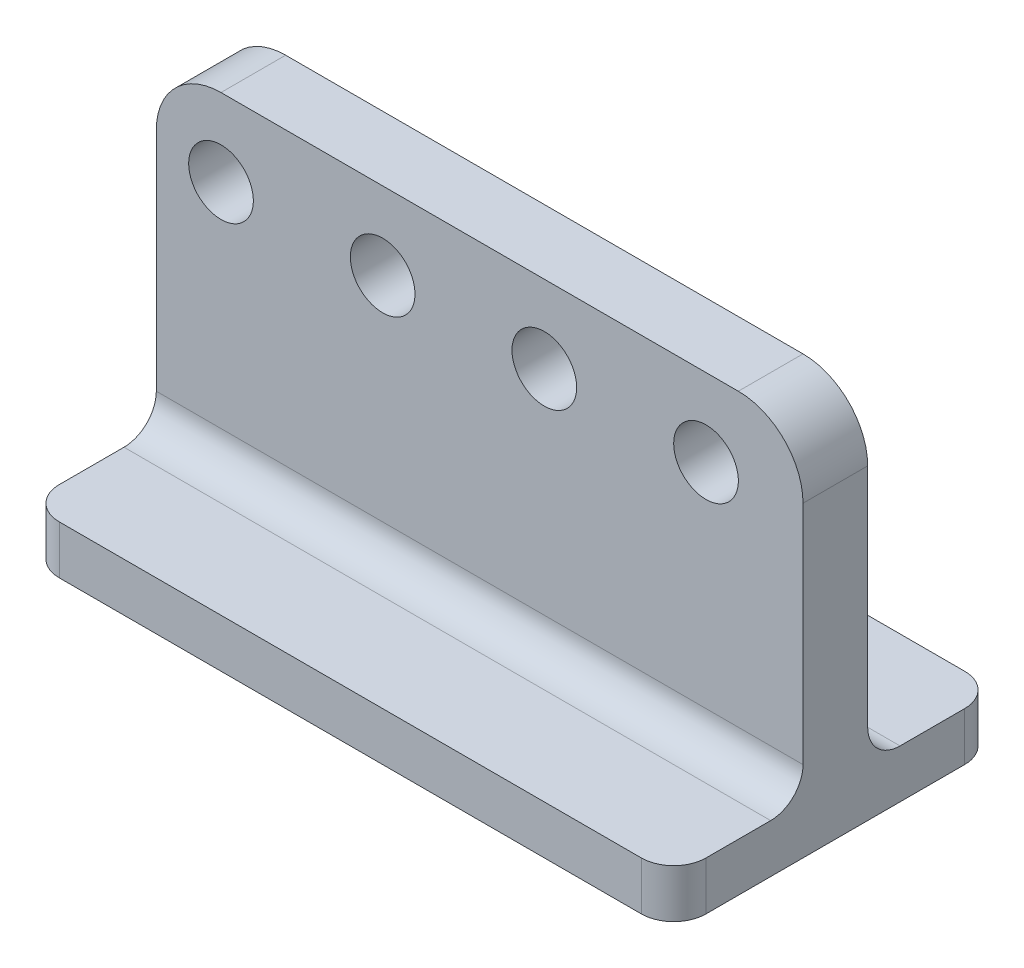
ISO-10303-21;
HEADER;
FILE_DESCRIPTION(('STEP AP214'),'2;1');
FILE_NAME('part.step','',(''),(''),'','','');
FILE_SCHEMA(('AUTOMOTIVE_DESIGN { 1 0 10303 214 1 1 1 1 }'));
ENDSEC;
DATA;
#1=APPLICATION_CONTEXT('core data for automotive mechanical design processes');
#2=APPLICATION_PROTOCOL_DEFINITION('international standard','automotive_design',2000,#1);
#3=PRODUCT_CONTEXT('',#1,'mechanical');
#4=PRODUCT('Part','Part','',(#3));
#5=PRODUCT_RELATED_PRODUCT_CATEGORY('part','',(#4));
#6=PRODUCT_DEFINITION_FORMATION('','',#4);
#7=PRODUCT_DEFINITION_CONTEXT('part definition',#1,'design');
#8=PRODUCT_DEFINITION('design','',#6,#7);
#9=PRODUCT_DEFINITION_SHAPE('','',#8);
#10=(LENGTH_UNIT() NAMED_UNIT(*) SI_UNIT(.MILLI.,.METRE.));
#11=(NAMED_UNIT(*) PLANE_ANGLE_UNIT() SI_UNIT($,.RADIAN.));
#12=(NAMED_UNIT(*) SI_UNIT($,.STERADIAN.) SOLID_ANGLE_UNIT());
#13=UNCERTAINTY_MEASURE_WITH_UNIT(LENGTH_MEASURE(1.E-05),#10,'distance_accuracy_value','');
#14=(GEOMETRIC_REPRESENTATION_CONTEXT(3) GLOBAL_UNCERTAINTY_ASSIGNED_CONTEXT((#13)) GLOBAL_UNIT_ASSIGNED_CONTEXT((#10,
#11,#12)) REPRESENTATION_CONTEXT('',''));
#15=CARTESIAN_POINT('',(0.,0.,0.));
#16=DIRECTION('',(0.,0.,1.));
#17=DIRECTION('',(1.,0.,0.));
#18=AXIS2_PLACEMENT_3D('',#15,#16,#17);
#19=CARTESIAN_POINT('',(0.,3.81,0.));
#20=DIRECTION('',(0.,1.,0.));
#21=DIRECTION('',(0.,0.,1.));
#22=AXIS2_PLACEMENT_3D('',#19,#20,#21);
#23=PLANE('',#22);
#24=DIRECTION('',(0.,0.,-1.));
#25=VECTOR('',#24,1.);
#26=CARTESIAN_POINT('',(55.2287179487179,3.81,-15.5005128205128));
#27=LINE('',#26,#25);
#28=CARTESIAN_POINT('',(55.2287179487179,3.81,-7.88051282051282));
#29=VERTEX_POINT('',#28);
#30=CARTESIAN_POINT('',(55.2287179487179,3.81,-12.9605128205128));
#31=VERTEX_POINT('',#30);
#32=EDGE_CURVE('E217',#29,#31,#27,.T.);
#33=ORIENTED_EDGE('',*,*,#32,.T.);
#34=CARTESIAN_POINT('',(52.6887179487179,3.81,-12.9605128205128));
#35=DIRECTION('',(0.,1.,0.));
#36=DIRECTION('',(0.,0.,1.));
#37=AXIS2_PLACEMENT_3D('',#34,#35,#36);
#38=CIRCLE('',#37,2.54);
#39=CARTESIAN_POINT('',(52.6887179487179,3.81,-15.5005128205128));
#40=VERTEX_POINT('',#39);
#41=EDGE_CURVE('E12',#31,#40,#38,.T.);
#42=ORIENTED_EDGE('',*,*,#41,.T.);
#43=DIRECTION('',(-1.,0.,0.));
#44=VECTOR('',#43,1.);
#45=CARTESIAN_POINT('',(4.42871794871793,3.81,-15.5005128205128));
#46=LINE('',#45,#44);
#47=CARTESIAN_POINT('',(6.96871794871793,3.81,-15.5005128205128));
#48=VERTEX_POINT('',#47);
#49=EDGE_CURVE('E221',#40,#48,#46,.T.);
#50=ORIENTED_EDGE('',*,*,#49,.T.);
#51=CARTESIAN_POINT('',(6.96871794871793,3.81,-12.9605128205128));
#52=DIRECTION('',(0.,1.,0.));
#53=DIRECTION('',(0.,0.,1.));
#54=AXIS2_PLACEMENT_3D('',#51,#52,#53);
#55=CIRCLE('',#54,2.54);
#56=CARTESIAN_POINT('',(4.42871794871793,3.81,-12.9605128205128));
#57=VERTEX_POINT('',#56);
#58=EDGE_CURVE('E49',#48,#57,#55,.T.);
#59=ORIENTED_EDGE('',*,*,#58,.T.);
#60=DIRECTION('',(0.,0.,1.));
#61=VECTOR('',#60,1.);
#62=CARTESIAN_POINT('',(4.42871794871793,3.81,-15.5005128205128));
#63=LINE('',#62,#61);
#64=CARTESIAN_POINT('',(4.42871794871793,3.81,-7.88051282051282));
#65=VERTEX_POINT('',#64);
#66=EDGE_CURVE('E209',#57,#65,#63,.T.);
#67=ORIENTED_EDGE('',*,*,#66,.T.);
#68=DIRECTION('',(-1.,0.,0.));
#69=VECTOR('',#68,1.);
#70=CARTESIAN_POINT('',(0.,3.81,-7.88051282051282));
#71=LINE('',#70,#69);
#72=EDGE_CURVE('E264',#65,#29,#71,.F.);
#73=ORIENTED_EDGE('',*,*,#72,.T.);
#74=EDGE_LOOP('',(#33,#42,#50,#59,#67,#73));
#75=FACE_BOUND('',#74,.T.);
#76=ADVANCED_FACE('F40',(#75),#23,.T.);
#77=CARTESIAN_POINT('',(4.42871794871793,3.81,-15.5005128205128));
#78=DIRECTION('',(1.,0.,0.));
#79=DIRECTION('',(0.,0.,-1.));
#80=AXIS2_PLACEMENT_3D('',#77,#78,#79);
#81=PLANE('',#80);
#82=DIRECTION('',(0.,0.,1.));
#83=VECTOR('',#82,1.);
#84=CARTESIAN_POINT('',(4.42871794871793,0.,-15.5005128205128));
#85=LINE('',#84,#83);
#86=CARTESIAN_POINT('',(4.42871794871793,0.,-12.9605128205128));
#87=VERTEX_POINT('',#86);
#88=CARTESIAN_POINT('',(4.42871794871793,0.,7.35948717948718));
#89=VERTEX_POINT('',#88);
#90=EDGE_CURVE('E208',#87,#89,#85,.T.);
#91=ORIENTED_EDGE('',*,*,#90,.T.);
#92=DIRECTION('',(0.,-1.,0.));
#93=VECTOR('',#92,1.);
#94=CARTESIAN_POINT('',(4.42871794871793,3.81,7.35948717948718));
#95=LINE('',#94,#93);
#96=CARTESIAN_POINT('',(4.42871794871793,3.81,7.35948717948718));
#97=VERTEX_POINT('',#96);
#98=EDGE_CURVE('E317',#89,#97,#95,.F.);
#99=ORIENTED_EDGE('',*,*,#98,.T.);
#100=CARTESIAN_POINT('',(4.42871794871793,3.81,2.27948717948718));
#101=VERTEX_POINT('',#100);
#102=EDGE_CURVE('E213',#101,#97,#63,.T.);
#103=ORIENTED_EDGE('',*,*,#102,.F.);
#104=CARTESIAN_POINT('',(4.42871794871793,6.35,2.27948717948718));
#105=DIRECTION('',(1.,0.,0.));
#106=DIRECTION('',(0.,0.,-1.));
#107=AXIS2_PLACEMENT_3D('',#104,#105,#106);
#108=CIRCLE('',#107,2.54);
#109=CARTESIAN_POINT('',(4.42871794871793,6.35,-0.260512820512816));
#110=VERTEX_POINT('',#109);
#111=EDGE_CURVE('E271',#101,#110,#108,.T.);
#112=ORIENTED_EDGE('',*,*,#111,.T.);
#113=DIRECTION('',(0.,-1.,0.));
#114=VECTOR('',#113,1.);
#115=CARTESIAN_POINT('',(4.42871794871793,29.21,-0.260512820512816));
#116=LINE('',#115,#114);
#117=CARTESIAN_POINT('',(4.42871794871793,24.13,-0.260512820512816));
#118=VERTEX_POINT('',#117);
#119=EDGE_CURVE('E205',#118,#110,#116,.T.);
#120=ORIENTED_EDGE('',*,*,#119,.F.);
#121=DIRECTION('',(0.,0.,1.));
#122=VECTOR('',#121,1.);
#123=CARTESIAN_POINT('',(4.42871794871793,24.13,-5.34051282051282));
#124=LINE('',#123,#122);
#125=CARTESIAN_POINT('',(4.42871794871793,24.13,-5.34051282051282));
#126=VERTEX_POINT('',#125);
#127=EDGE_CURVE('E159',#118,#126,#124,.F.);
#128=ORIENTED_EDGE('',*,*,#127,.T.);
#129=DIRECTION('',(0.,-1.,0.));
#130=VECTOR('',#129,1.);
#131=CARTESIAN_POINT('',(4.42871794871793,29.21,-5.34051282051282));
#132=LINE('',#131,#130);
#133=CARTESIAN_POINT('',(4.42871794871793,6.35,-5.34051282051282));
#134=VERTEX_POINT('',#133);
#135=EDGE_CURVE('E187',#126,#134,#132,.T.);
#136=ORIENTED_EDGE('',*,*,#135,.T.);
#137=CARTESIAN_POINT('',(4.42871794871793,6.35,-7.88051282051282));
#138=DIRECTION('',(1.,0.,0.));
#139=DIRECTION('',(0.,0.,-1.));
#140=AXIS2_PLACEMENT_3D('',#137,#138,#139);
#141=CIRCLE('',#140,2.54);
#142=EDGE_CURVE('E274',#134,#65,#141,.T.);
#143=ORIENTED_EDGE('',*,*,#142,.T.);
#144=ORIENTED_EDGE('',*,*,#66,.F.);
#145=DIRECTION('',(0.,-1.,0.));
#146=VECTOR('',#145,1.);
#147=CARTESIAN_POINT('',(4.42871794871793,3.81,-12.9605128205128));
#148=LINE('',#147,#146);
#149=EDGE_CURVE('E313',#57,#87,#148,.T.);
#150=ORIENTED_EDGE('',*,*,#149,.T.);
#151=EDGE_LOOP('',(#91,#99,#103,#112,#120,#128,#136,#143,#144,#150));
#152=FACE_BOUND('',#151,.T.);
#153=ADVANCED_FACE('F331',(#152),#81,.F.);
#154=CARTESIAN_POINT('',(4.42871794871793,3.81,9.89948717948718));
#155=DIRECTION('',(0.,0.,-1.));
#156=DIRECTION('',(-1.,0.,0.));
#157=AXIS2_PLACEMENT_3D('',#154,#155,#156);
#158=PLANE('',#157);
#159=DIRECTION('',(1.,0.,0.));
#160=VECTOR('',#159,1.);
#161=CARTESIAN_POINT('',(4.42871794871793,0.,9.89948717948718));
#162=LINE('',#161,#160);
#163=CARTESIAN_POINT('',(6.96871794871793,0.,9.89948717948718));
#164=VERTEX_POINT('',#163);
#165=CARTESIAN_POINT('',(52.6887179487179,0.,9.89948717948718));
#166=VERTEX_POINT('',#165);
#167=EDGE_CURVE('E227',#164,#166,#162,.T.);
#168=ORIENTED_EDGE('',*,*,#167,.T.);
#169=DIRECTION('',(0.,-1.,0.));
#170=VECTOR('',#169,1.);
#171=CARTESIAN_POINT('',(52.6887179487179,3.81,9.89948717948718));
#172=LINE('',#171,#170);
#173=CARTESIAN_POINT('',(52.6887179487179,3.81,9.89948717948718));
#174=VERTEX_POINT('',#173);
#175=EDGE_CURVE('E304',#166,#174,#172,.F.);
#176=ORIENTED_EDGE('',*,*,#175,.T.);
#177=DIRECTION('',(1.,0.,0.));
#178=VECTOR('',#177,1.);
#179=CARTESIAN_POINT('',(4.42871794871793,3.81,9.89948717948718));
#180=LINE('',#179,#178);
#181=CARTESIAN_POINT('',(6.96871794871793,3.81,9.89948717948718));
#182=VERTEX_POINT('',#181);
#183=EDGE_CURVE('E212',#182,#174,#180,.T.);
#184=ORIENTED_EDGE('',*,*,#183,.F.);
#185=DIRECTION('',(0.,-1.,0.));
#186=VECTOR('',#185,1.);
#187=CARTESIAN_POINT('',(6.96871794871793,3.81,9.89948717948718));
#188=LINE('',#187,#186);
#189=EDGE_CURVE('E300',#182,#164,#188,.T.);
#190=ORIENTED_EDGE('',*,*,#189,.T.);
#191=EDGE_LOOP('',(#168,#176,#184,#190));
#192=FACE_BOUND('',#191,.T.);
#193=ADVANCED_FACE('F354',(#192),#158,.F.);
#194=CARTESIAN_POINT('',(55.2287179487179,3.81,-15.5005128205128));
#195=DIRECTION('',(-1.,0.,0.));
#196=DIRECTION('',(0.,0.,1.));
#197=AXIS2_PLACEMENT_3D('',#194,#195,#196);
#198=PLANE('',#197);
#199=CARTESIAN_POINT('',(55.2287179487179,3.81,7.35948717948718));
#200=VERTEX_POINT('',#199);
#201=CARTESIAN_POINT('',(55.2287179487179,3.81,2.27948717948718));
#202=VERTEX_POINT('',#201);
#203=EDGE_CURVE('E218',#200,#202,#27,.T.);
#204=ORIENTED_EDGE('',*,*,#203,.F.);
#205=DIRECTION('',(0.,-1.,0.));
#206=VECTOR('',#205,1.);
#207=CARTESIAN_POINT('',(55.2287179487179,3.81,7.35948717948718));
#208=LINE('',#207,#206);
#209=CARTESIAN_POINT('',(55.2287179487179,0.,7.35948717948718));
#210=VERTEX_POINT('',#209);
#211=EDGE_CURVE('E284',#200,#210,#208,.T.);
#212=ORIENTED_EDGE('',*,*,#211,.T.);
#213=DIRECTION('',(0.,0.,-1.));
#214=VECTOR('',#213,1.);
#215=CARTESIAN_POINT('',(55.2287179487179,0.,-15.5005128205128));
#216=LINE('',#215,#214);
#217=CARTESIAN_POINT('',(55.2287179487179,0.,-12.9605128205128));
#218=VERTEX_POINT('',#217);
#219=EDGE_CURVE('E231',#210,#218,#216,.T.);
#220=ORIENTED_EDGE('',*,*,#219,.T.);
#221=DIRECTION('',(0.,-1.,0.));
#222=VECTOR('',#221,1.);
#223=CARTESIAN_POINT('',(55.2287179487179,3.81,-12.9605128205128));
#224=LINE('',#223,#222);
#225=EDGE_CURVE('E281',#218,#31,#224,.F.);
#226=ORIENTED_EDGE('',*,*,#225,.T.);
#227=ORIENTED_EDGE('',*,*,#32,.F.);
#228=CARTESIAN_POINT('',(55.2287179487179,6.35,-7.88051282051282));
#229=DIRECTION('',(-1.,0.,0.));
#230=DIRECTION('',(0.,0.,1.));
#231=AXIS2_PLACEMENT_3D('',#228,#229,#230);
#232=CIRCLE('',#231,2.54);
#233=CARTESIAN_POINT('',(55.2287179487179,6.35,-5.34051282051282));
#234=VERTEX_POINT('',#233);
#235=EDGE_CURVE('E278',#29,#234,#232,.T.);
#236=ORIENTED_EDGE('',*,*,#235,.T.);
#237=DIRECTION('',(0.,-1.,0.));
#238=VECTOR('',#237,1.);
#239=CARTESIAN_POINT('',(55.2287179487179,29.21,-5.34051282051282));
#240=LINE('',#239,#238);
#241=CARTESIAN_POINT('',(55.2287179487179,24.13,-5.34051282051282));
#242=VERTEX_POINT('',#241);
#243=EDGE_CURVE('E197',#242,#234,#240,.T.);
#244=ORIENTED_EDGE('',*,*,#243,.F.);
#245=DIRECTION('',(0.,0.,-1.));
#246=VECTOR('',#245,1.);
#247=CARTESIAN_POINT('',(55.2287179487179,24.13,-0.260512820512817));
#248=LINE('',#247,#246);
#249=CARTESIAN_POINT('',(55.2287179487179,24.13,-0.260512820512817));
#250=VERTEX_POINT('',#249);
#251=EDGE_CURVE('E250',#242,#250,#248,.F.);
#252=ORIENTED_EDGE('',*,*,#251,.T.);
#253=DIRECTION('',(0.,-1.,0.));
#254=VECTOR('',#253,1.);
#255=CARTESIAN_POINT('',(55.2287179487179,29.21,-0.260512820512817));
#256=LINE('',#255,#254);
#257=CARTESIAN_POINT('',(55.2287179487179,6.35,-0.260512820512817));
#258=VERTEX_POINT('',#257);
#259=EDGE_CURVE('E201',#250,#258,#256,.T.);
#260=ORIENTED_EDGE('',*,*,#259,.T.);
#261=CARTESIAN_POINT('',(55.2287179487179,6.35,2.27948717948718));
#262=DIRECTION('',(-1.,0.,0.));
#263=DIRECTION('',(0.,0.,1.));
#264=AXIS2_PLACEMENT_3D('',#261,#262,#263);
#265=CIRCLE('',#264,2.54);
#266=EDGE_CURVE('E267',#258,#202,#265,.T.);
#267=ORIENTED_EDGE('',*,*,#266,.T.);
#268=EDGE_LOOP('',(#204,#212,#220,#226,#227,#236,#244,#252,#260,#267));
#269=FACE_BOUND('',#268,.T.);
#270=ADVANCED_FACE('F345',(#269),#198,.F.);
#271=CARTESIAN_POINT('',(4.42871794871793,3.81,-15.5005128205128));
#272=DIRECTION('',(0.,0.,1.));
#273=DIRECTION('',(1.,0.,0.));
#274=AXIS2_PLACEMENT_3D('',#271,#272,#273);
#275=PLANE('',#274);
#276=ORIENTED_EDGE('',*,*,#49,.F.);
#277=DIRECTION('',(0.,-1.,0.));
#278=VECTOR('',#277,1.);
#279=CARTESIAN_POINT('',(52.6887179487179,3.81,-15.5005128205128));
#280=LINE('',#279,#278);
#281=CARTESIAN_POINT('',(52.6887179487179,0.,-15.5005128205128));
#282=VERTEX_POINT('',#281);
#283=EDGE_CURVE('E322',#40,#282,#280,.T.);
#284=ORIENTED_EDGE('',*,*,#283,.T.);
#285=DIRECTION('',(-1.,0.,0.));
#286=VECTOR('',#285,1.);
#287=CARTESIAN_POINT('',(4.42871794871793,0.,-15.5005128205128));
#288=LINE('',#287,#286);
#289=CARTESIAN_POINT('',(6.96871794871793,0.,-15.5005128205128));
#290=VERTEX_POINT('',#289);
#291=EDGE_CURVE('E235',#282,#290,#288,.T.);
#292=ORIENTED_EDGE('',*,*,#291,.T.);
#293=DIRECTION('',(0.,-1.,0.));
#294=VECTOR('',#293,1.);
#295=CARTESIAN_POINT('',(6.96871794871793,3.81,-15.5005128205128));
#296=LINE('',#295,#294);
#297=EDGE_CURVE('E56',#290,#48,#296,.F.);
#298=ORIENTED_EDGE('',*,*,#297,.T.);
#299=EDGE_LOOP('',(#276,#284,#292,#298));
#300=FACE_BOUND('',#299,.T.);
#301=ADVANCED_FACE('F338',(#300),#275,.F.);
#302=ORIENTED_EDGE('',*,*,#183,.T.);
#303=CARTESIAN_POINT('',(52.6887179487179,3.81,7.35948717948718));
#304=DIRECTION('',(0.,1.,0.));
#305=DIRECTION('',(0.,0.,1.));
#306=AXIS2_PLACEMENT_3D('',#303,#304,#305);
#307=CIRCLE('',#306,2.54);
#308=EDGE_CURVE('E310',#174,#200,#307,.T.);
#309=ORIENTED_EDGE('',*,*,#308,.T.);
#310=ORIENTED_EDGE('',*,*,#203,.T.);
#311=DIRECTION('',(1.,0.,0.));
#312=VECTOR('',#311,1.);
#313=CARTESIAN_POINT('',(0.,3.81,2.27948717948718));
#314=LINE('',#313,#312);
#315=EDGE_CURVE('E257',#202,#101,#314,.F.);
#316=ORIENTED_EDGE('',*,*,#315,.T.);
#317=ORIENTED_EDGE('',*,*,#102,.T.);
#318=CARTESIAN_POINT('',(6.96871794871793,3.81,7.35948717948718));
#319=DIRECTION('',(0.,1.,0.));
#320=DIRECTION('',(0.,0.,1.));
#321=AXIS2_PLACEMENT_3D('',#318,#319,#320);
#322=CIRCLE('',#321,2.54);
#323=EDGE_CURVE('E307',#97,#182,#322,.T.);
#324=ORIENTED_EDGE('',*,*,#323,.T.);
#325=EDGE_LOOP('',(#302,#309,#310,#316,#317,#324));
#326=FACE_BOUND('',#325,.T.);
#327=ADVANCED_FACE('F365',(#326),#23,.T.);
#328=CARTESIAN_POINT('',(0.,0.,0.));
#329=DIRECTION('',(0.,1.,0.));
#330=DIRECTION('',(0.,0.,1.));
#331=AXIS2_PLACEMENT_3D('',#328,#329,#330);
#332=PLANE('',#331);
#333=ORIENTED_EDGE('',*,*,#219,.F.);
#334=CARTESIAN_POINT('',(52.6887179487179,0.,7.35948717948718));
#335=DIRECTION('',(0.,1.,0.));
#336=DIRECTION('',(0.,0.,1.));
#337=AXIS2_PLACEMENT_3D('',#334,#335,#336);
#338=CIRCLE('',#337,2.54);
#339=EDGE_CURVE('E297',#210,#166,#338,.F.);
#340=ORIENTED_EDGE('',*,*,#339,.T.);
#341=ORIENTED_EDGE('',*,*,#167,.F.);
#342=CARTESIAN_POINT('',(6.96871794871793,0.,7.35948717948718));
#343=DIRECTION('',(0.,1.,0.));
#344=DIRECTION('',(0.,0.,1.));
#345=AXIS2_PLACEMENT_3D('',#342,#343,#344);
#346=CIRCLE('',#345,2.54);
#347=EDGE_CURVE('E294',#164,#89,#346,.F.);
#348=ORIENTED_EDGE('',*,*,#347,.T.);
#349=ORIENTED_EDGE('',*,*,#90,.F.);
#350=CARTESIAN_POINT('',(6.96871794871793,0.,-12.9605128205128));
#351=DIRECTION('',(0.,1.,0.));
#352=DIRECTION('',(0.,0.,1.));
#353=AXIS2_PLACEMENT_3D('',#350,#351,#352);
#354=CIRCLE('',#353,2.54);
#355=EDGE_CURVE('E288',#87,#290,#354,.F.);
#356=ORIENTED_EDGE('',*,*,#355,.T.);
#357=ORIENTED_EDGE('',*,*,#291,.F.);
#358=CARTESIAN_POINT('',(52.6887179487179,0.,-12.9605128205128));
#359=DIRECTION('',(0.,1.,0.));
#360=DIRECTION('',(0.,0.,1.));
#361=AXIS2_PLACEMENT_3D('',#358,#359,#360);
#362=CIRCLE('',#361,2.54);
#363=EDGE_CURVE('E291',#282,#218,#362,.F.);
#364=ORIENTED_EDGE('',*,*,#363,.T.);
#365=EDGE_LOOP('',(#333,#340,#341,#348,#349,#356,#357,#364));
#366=FACE_BOUND('',#365,.T.);
#367=ADVANCED_FACE('F337',(#366),#332,.F.);
#368=CARTESIAN_POINT('',(4.42871794871793,29.21,-0.260512820512816));
#369=DIRECTION('',(0.,0.,-1.));
#370=DIRECTION('',(-1.,0.,0.));
#371=AXIS2_PLACEMENT_3D('',#368,#369,#370);
#372=PLANE('',#371);
#373=CARTESIAN_POINT('',(9.50871794871793,23.114,-0.260512820512815));
#374=DIRECTION('',(0.,0.,-1.));
#375=DIRECTION('',(-1.,0.,0.));
#376=AXIS2_PLACEMENT_3D('',#373,#374,#375);
#377=CIRCLE('',#376,2.54);
#378=CARTESIAN_POINT('',(6.96871794871793,23.114,-0.260512820512815));
#379=VERTEX_POINT('',#378);
#380=EDGE_CURVE('E183',#379,#379,#377,.T.);
#381=ORIENTED_EDGE('',*,*,#380,.T.);
#382=EDGE_LOOP('',(#381));
#383=FACE_BOUND('',#382,.T.);
#384=CARTESIAN_POINT('',(22.2087179487179,23.114,-0.260512820512815));
#385=DIRECTION('',(0.,0.,-1.));
#386=DIRECTION('',(-1.,0.,0.));
#387=AXIS2_PLACEMENT_3D('',#384,#385,#386);
#388=CIRCLE('',#387,2.54);
#389=CARTESIAN_POINT('',(19.6687179487179,23.114,-0.260512820512815));
#390=VERTEX_POINT('',#389);
#391=EDGE_CURVE('E190',#390,#390,#388,.T.);
#392=ORIENTED_EDGE('',*,*,#391,.T.);
#393=EDGE_LOOP('',(#392));
#394=FACE_BOUND('',#393,.T.);
#395=CARTESIAN_POINT('',(34.9087179487179,23.114,-0.260512820512815));
#396=DIRECTION('',(0.,0.,-1.));
#397=DIRECTION('',(-1.,0.,0.));
#398=AXIS2_PLACEMENT_3D('',#395,#396,#397);
#399=CIRCLE('',#398,2.54);
#400=CARTESIAN_POINT('',(32.3687179487179,23.114,-0.260512820512815));
#401=VERTEX_POINT('',#400);
#402=EDGE_CURVE('E566',#401,#401,#399,.T.);
#403=ORIENTED_EDGE('',*,*,#402,.T.);
#404=EDGE_LOOP('',(#403));
#405=FACE_BOUND('',#404,.T.);
#406=CARTESIAN_POINT('',(47.6087179487179,23.114,-0.260512820512815));
#407=DIRECTION('',(0.,0.,-1.));
#408=DIRECTION('',(-1.,0.,0.));
#409=AXIS2_PLACEMENT_3D('',#406,#407,#408);
#410=CIRCLE('',#409,2.54);
#411=CARTESIAN_POINT('',(45.0687179487179,23.114,-0.260512820512815));
#412=VERTEX_POINT('',#411);
#413=EDGE_CURVE('E563',#412,#412,#410,.T.);
#414=ORIENTED_EDGE('',*,*,#413,.T.);
#415=EDGE_LOOP('',(#414));
#416=FACE_BOUND('',#415,.T.);
#417=ORIENTED_EDGE('',*,*,#119,.T.);
#418=DIRECTION('',(1.,0.,0.));
#419=VECTOR('',#418,1.);
#420=CARTESIAN_POINT('',(4.42871794871793,6.35,-0.260512820512816));
#421=LINE('',#420,#419);
#422=EDGE_CURVE('E253',#110,#258,#421,.T.);
#423=ORIENTED_EDGE('',*,*,#422,.T.);
#424=ORIENTED_EDGE('',*,*,#259,.F.);
#425=CARTESIAN_POINT('',(50.1487179487179,24.13,-0.260512820512816));
#426=DIRECTION('',(0.,0.,-1.));
#427=DIRECTION('',(-1.,0.,0.));
#428=AXIS2_PLACEMENT_3D('',#425,#426,#427);
#429=CIRCLE('',#428,5.08);
#430=CARTESIAN_POINT('',(50.1487179487179,29.21,-0.260512820512816));
#431=VERTEX_POINT('',#430);
#432=EDGE_CURVE('E165',#250,#431,#429,.F.);
#433=ORIENTED_EDGE('',*,*,#432,.T.);
#434=DIRECTION('',(1.,0.,0.));
#435=VECTOR('',#434,1.);
#436=CARTESIAN_POINT('',(4.42871794871793,29.21,-0.260512820512816));
#437=LINE('',#436,#435);
#438=CARTESIAN_POINT('',(9.50871794871793,29.21,-0.260512820512816));
#439=VERTEX_POINT('',#438);
#440=EDGE_CURVE('E172',#439,#431,#437,.T.);
#441=ORIENTED_EDGE('',*,*,#440,.F.);
#442=CARTESIAN_POINT('',(9.50871794871793,24.13,-0.260512820512816));
#443=DIRECTION('',(0.,0.,-1.));
#444=DIRECTION('',(-1.,0.,0.));
#445=AXIS2_PLACEMENT_3D('',#442,#443,#444);
#446=CIRCLE('',#445,5.08);
#447=EDGE_CURVE('E154',#439,#118,#446,.F.);
#448=ORIENTED_EDGE('',*,*,#447,.T.);
#449=EDGE_LOOP('',(#417,#423,#424,#433,#441,#448));
#450=FACE_BOUND('',#449,.T.);
#451=ADVANCED_FACE('F179',(#383,#394,#405,#416,#450),#372,.F.);
#452=CARTESIAN_POINT('',(4.42871794871793,29.21,-5.34051282051282));
#453=DIRECTION('',(0.,0.,1.));
#454=DIRECTION('',(1.,0.,0.));
#455=AXIS2_PLACEMENT_3D('',#452,#453,#454);
#456=PLANE('',#455);
#457=CARTESIAN_POINT('',(9.50871794871793,23.114,-5.34051282051282));
#458=DIRECTION('',(0.,0.,-1.));
#459=DIRECTION('',(-1.,0.,0.));
#460=AXIS2_PLACEMENT_3D('',#457,#458,#459);
#461=CIRCLE('',#460,2.54);
#462=CARTESIAN_POINT('',(6.96871794871793,23.114,-5.34051282051282));
#463=VERTEX_POINT('',#462);
#464=EDGE_CURVE('E567',#463,#463,#461,.T.);
#465=ORIENTED_EDGE('',*,*,#464,.F.);
#466=EDGE_LOOP('',(#465));
#467=FACE_BOUND('',#466,.T.);
#468=CARTESIAN_POINT('',(22.2087179487179,23.114,-5.34051282051282));
#469=DIRECTION('',(0.,0.,-1.));
#470=DIRECTION('',(-1.,0.,0.));
#471=AXIS2_PLACEMENT_3D('',#468,#469,#470);
#472=CIRCLE('',#471,2.54);
#473=CARTESIAN_POINT('',(19.6687179487179,23.114,-5.34051282051282));
#474=VERTEX_POINT('',#473);
#475=EDGE_CURVE('E574',#474,#474,#472,.T.);
#476=ORIENTED_EDGE('',*,*,#475,.F.);
#477=EDGE_LOOP('',(#476));
#478=FACE_BOUND('',#477,.T.);
#479=CARTESIAN_POINT('',(34.9087179487179,23.114,-5.34051282051282));
#480=DIRECTION('',(0.,0.,-1.));
#481=DIRECTION('',(-1.,0.,0.));
#482=AXIS2_PLACEMENT_3D('',#479,#480,#481);
#483=CIRCLE('',#482,2.54);
#484=CARTESIAN_POINT('',(32.3687179487179,23.114,-5.34051282051282));
#485=VERTEX_POINT('',#484);
#486=EDGE_CURVE('E587',#485,#485,#483,.T.);
#487=ORIENTED_EDGE('',*,*,#486,.F.);
#488=EDGE_LOOP('',(#487));
#489=FACE_BOUND('',#488,.T.);
#490=CARTESIAN_POINT('',(47.6087179487179,23.114,-5.34051282051282));
#491=DIRECTION('',(0.,0.,-1.));
#492=DIRECTION('',(-1.,0.,0.));
#493=AXIS2_PLACEMENT_3D('',#490,#491,#492);
#494=CIRCLE('',#493,2.54);
#495=CARTESIAN_POINT('',(45.0687179487179,23.114,-5.34051282051282));
#496=VERTEX_POINT('',#495);
#497=EDGE_CURVE('E560',#496,#496,#494,.T.);
#498=ORIENTED_EDGE('',*,*,#497,.F.);
#499=EDGE_LOOP('',(#498));
#500=FACE_BOUND('',#499,.T.);
#501=ORIENTED_EDGE('',*,*,#243,.T.);
#502=DIRECTION('',(-1.,0.,0.));
#503=VECTOR('',#502,1.);
#504=CARTESIAN_POINT('',(4.42871794871793,6.35,-5.34051282051282));
#505=LINE('',#504,#503);
#506=EDGE_CURVE('E260',#234,#134,#505,.T.);
#507=ORIENTED_EDGE('',*,*,#506,.T.);
#508=ORIENTED_EDGE('',*,*,#135,.F.);
#509=CARTESIAN_POINT('',(9.50871794871793,24.13,-5.34051282051282));
#510=DIRECTION('',(0.,0.,1.));
#511=DIRECTION('',(1.,0.,0.));
#512=AXIS2_PLACEMENT_3D('',#509,#510,#511);
#513=CIRCLE('',#512,5.08);
#514=CARTESIAN_POINT('',(9.50871794871793,29.21,-5.34051282051282));
#515=VERTEX_POINT('',#514);
#516=EDGE_CURVE('E247',#126,#515,#513,.F.);
#517=ORIENTED_EDGE('',*,*,#516,.T.);
#518=DIRECTION('',(-1.,0.,0.));
#519=VECTOR('',#518,1.);
#520=CARTESIAN_POINT('',(4.42871794871793,29.21,-5.34051282051282));
#521=LINE('',#520,#519);
#522=CARTESIAN_POINT('',(50.1487179487179,29.21,-5.34051282051282));
#523=VERTEX_POINT('',#522);
#524=EDGE_CURVE('E175',#523,#515,#521,.T.);
#525=ORIENTED_EDGE('',*,*,#524,.F.);
#526=CARTESIAN_POINT('',(50.1487179487179,24.13,-5.34051282051282));
#527=DIRECTION('',(0.,0.,1.));
#528=DIRECTION('',(1.,0.,0.));
#529=AXIS2_PLACEMENT_3D('',#526,#527,#528);
#530=CIRCLE('',#529,5.08);
#531=EDGE_CURVE('E244',#523,#242,#530,.F.);
#532=ORIENTED_EDGE('',*,*,#531,.T.);
#533=EDGE_LOOP('',(#501,#507,#508,#517,#525,#532));
#534=FACE_BOUND('',#533,.T.);
#535=ADVANCED_FACE('F376',(#467,#478,#489,#500,#534),#456,.F.);
#536=CARTESIAN_POINT('',(0.,29.21,0.));
#537=DIRECTION('',(0.,1.,0.));
#538=DIRECTION('',(0.,0.,1.));
#539=AXIS2_PLACEMENT_3D('',#536,#537,#538);
#540=PLANE('',#539);
#541=ORIENTED_EDGE('',*,*,#524,.T.);
#542=DIRECTION('',(0.,0.,1.));
#543=VECTOR('',#542,1.);
#544=CARTESIAN_POINT('',(9.50871794871793,29.21,-0.260512820512816));
#545=LINE('',#544,#543);
#546=EDGE_CURVE('E158',#515,#439,#545,.T.);
#547=ORIENTED_EDGE('',*,*,#546,.T.);
#548=ORIENTED_EDGE('',*,*,#440,.T.);
#549=DIRECTION('',(0.,0.,-1.));
#550=VECTOR('',#549,1.);
#551=CARTESIAN_POINT('',(50.1487179487179,29.21,-5.34051282051282));
#552=LINE('',#551,#550);
#553=EDGE_CURVE('E177',#431,#523,#552,.T.);
#554=ORIENTED_EDGE('',*,*,#553,.T.);
#555=EDGE_LOOP('',(#541,#547,#548,#554));
#556=FACE_BOUND('',#555,.T.);
#557=ADVANCED_FACE('F170',(#556),#540,.T.);
#558=CARTESIAN_POINT('',(47.6087179487179,23.114,20.0594871794872));
#559=DIRECTION('',(0.,0.,-1.));
#560=DIRECTION('',(-1.,0.,0.));
#561=AXIS2_PLACEMENT_3D('',#558,#559,#560);
#562=CYLINDRICAL_SURFACE('',#561,2.54);
#563=ORIENTED_EDGE('',*,*,#497,.T.);
#564=EDGE_LOOP('',(#563));
#565=FACE_BOUND('',#564,.T.);
#566=ORIENTED_EDGE('',*,*,#413,.F.);
#567=EDGE_LOOP('',(#566));
#568=FACE_BOUND('',#567,.T.);
#569=ADVANCED_FACE('F517',(#565,#568),#562,.F.);
#570=CARTESIAN_POINT('',(34.9087179487179,23.114,20.0594871794872));
#571=DIRECTION('',(0.,0.,-1.));
#572=DIRECTION('',(-1.,0.,0.));
#573=AXIS2_PLACEMENT_3D('',#570,#571,#572);
#574=CYLINDRICAL_SURFACE('',#573,2.54);
#575=ORIENTED_EDGE('',*,*,#486,.T.);
#576=EDGE_LOOP('',(#575));
#577=FACE_BOUND('',#576,.T.);
#578=ORIENTED_EDGE('',*,*,#402,.F.);
#579=EDGE_LOOP('',(#578));
#580=FACE_BOUND('',#579,.T.);
#581=ADVANCED_FACE('F536',(#577,#580),#574,.F.);
#582=CARTESIAN_POINT('',(22.2087179487179,23.114,20.0594871794872));
#583=DIRECTION('',(0.,0.,-1.));
#584=DIRECTION('',(-1.,0.,0.));
#585=AXIS2_PLACEMENT_3D('',#582,#583,#584);
#586=CYLINDRICAL_SURFACE('',#585,2.54);
#587=ORIENTED_EDGE('',*,*,#475,.T.);
#588=EDGE_LOOP('',(#587));
#589=FACE_BOUND('',#588,.T.);
#590=ORIENTED_EDGE('',*,*,#391,.F.);
#591=EDGE_LOOP('',(#590));
#592=FACE_BOUND('',#591,.T.);
#593=ADVANCED_FACE('F526',(#589,#592),#586,.F.);
#594=CARTESIAN_POINT('',(9.50871794871793,23.114,20.0594871794872));
#595=DIRECTION('',(0.,0.,-1.));
#596=DIRECTION('',(-1.,0.,0.));
#597=AXIS2_PLACEMENT_3D('',#594,#595,#596);
#598=CYLINDRICAL_SURFACE('',#597,2.54);
#599=ORIENTED_EDGE('',*,*,#464,.T.);
#600=EDGE_LOOP('',(#599));
#601=FACE_BOUND('',#600,.T.);
#602=ORIENTED_EDGE('',*,*,#380,.F.);
#603=EDGE_LOOP('',(#602));
#604=FACE_BOUND('',#603,.T.);
#605=ADVANCED_FACE('F390',(#601,#604),#598,.F.);
#606=CARTESIAN_POINT('',(9.50871794871793,24.13,0.));
#607=DIRECTION('',(0.,0.,-1.));
#608=DIRECTION('',(-1.,0.,0.));
#609=AXIS2_PLACEMENT_3D('',#606,#607,#608);
#610=CYLINDRICAL_SURFACE('',#609,5.08);
#611=ORIENTED_EDGE('',*,*,#516,.F.);
#612=ORIENTED_EDGE('',*,*,#127,.F.);
#613=ORIENTED_EDGE('',*,*,#447,.F.);
#614=ORIENTED_EDGE('',*,*,#546,.F.);
#615=EDGE_LOOP('',(#611,#612,#613,#614));
#616=FACE_BOUND('',#615,.T.);
#617=ADVANCED_FACE('F157',(#616),#610,.T.);
#618=CARTESIAN_POINT('',(50.1487179487179,24.13,0.));
#619=DIRECTION('',(0.,0.,1.));
#620=DIRECTION('',(1.,0.,0.));
#621=AXIS2_PLACEMENT_3D('',#618,#619,#620);
#622=CYLINDRICAL_SURFACE('',#621,5.08);
#623=ORIENTED_EDGE('',*,*,#432,.F.);
#624=ORIENTED_EDGE('',*,*,#251,.F.);
#625=ORIENTED_EDGE('',*,*,#531,.F.);
#626=ORIENTED_EDGE('',*,*,#553,.F.);
#627=EDGE_LOOP('',(#623,#624,#625,#626));
#628=FACE_BOUND('',#627,.T.);
#629=ADVANCED_FACE('F382',(#628),#622,.T.);
#630=CARTESIAN_POINT('',(4.42871794871793,6.35,2.27948717948718));
#631=DIRECTION('',(1.,0.,0.));
#632=DIRECTION('',(0.,0.,-1.));
#633=AXIS2_PLACEMENT_3D('',#630,#631,#632);
#634=CYLINDRICAL_SURFACE('',#633,2.54);
#635=ORIENTED_EDGE('',*,*,#111,.F.);
#636=ORIENTED_EDGE('',*,*,#315,.F.);
#637=ORIENTED_EDGE('',*,*,#266,.F.);
#638=ORIENTED_EDGE('',*,*,#422,.F.);
#639=EDGE_LOOP('',(#635,#636,#637,#638));
#640=FACE_BOUND('',#639,.T.);
#641=ADVANCED_FACE('F379',(#640),#634,.F.);
#642=CARTESIAN_POINT('',(4.42871794871793,6.35,-7.88051282051282));
#643=DIRECTION('',(-1.,0.,0.));
#644=DIRECTION('',(0.,0.,1.));
#645=AXIS2_PLACEMENT_3D('',#642,#643,#644);
#646=CYLINDRICAL_SURFACE('',#645,2.54);
#647=ORIENTED_EDGE('',*,*,#235,.F.);
#648=ORIENTED_EDGE('',*,*,#72,.F.);
#649=ORIENTED_EDGE('',*,*,#142,.F.);
#650=ORIENTED_EDGE('',*,*,#506,.F.);
#651=EDGE_LOOP('',(#647,#648,#649,#650));
#652=FACE_BOUND('',#651,.T.);
#653=ADVANCED_FACE('F373',(#652),#646,.F.);
#654=CARTESIAN_POINT('',(52.6887179487179,3.81,7.35948717948718));
#655=DIRECTION('',(0.,-1.,0.));
#656=DIRECTION('',(0.,0.,-1.));
#657=AXIS2_PLACEMENT_3D('',#654,#655,#656);
#658=CYLINDRICAL_SURFACE('',#657,2.54);
#659=ORIENTED_EDGE('',*,*,#308,.F.);
#660=ORIENTED_EDGE('',*,*,#175,.F.);
#661=ORIENTED_EDGE('',*,*,#339,.F.);
#662=ORIENTED_EDGE('',*,*,#211,.F.);
#663=EDGE_LOOP('',(#659,#660,#661,#662));
#664=FACE_BOUND('',#663,.T.);
#665=ADVANCED_FACE('F350',(#664),#658,.T.);
#666=CARTESIAN_POINT('',(6.96871794871793,3.81,7.35948717948718));
#667=DIRECTION('',(0.,-1.,0.));
#668=DIRECTION('',(0.,0.,-1.));
#669=AXIS2_PLACEMENT_3D('',#666,#667,#668);
#670=CYLINDRICAL_SURFACE('',#669,2.54);
#671=ORIENTED_EDGE('',*,*,#323,.F.);
#672=ORIENTED_EDGE('',*,*,#98,.F.);
#673=ORIENTED_EDGE('',*,*,#347,.F.);
#674=ORIENTED_EDGE('',*,*,#189,.F.);
#675=EDGE_LOOP('',(#671,#672,#673,#674));
#676=FACE_BOUND('',#675,.T.);
#677=ADVANCED_FACE('F359',(#676),#670,.T.);
#678=CARTESIAN_POINT('',(52.6887179487179,3.81,-12.9605128205128));
#679=DIRECTION('',(0.,-1.,0.));
#680=DIRECTION('',(0.,0.,-1.));
#681=AXIS2_PLACEMENT_3D('',#678,#679,#680);
#682=CYLINDRICAL_SURFACE('',#681,2.54);
#683=ORIENTED_EDGE('',*,*,#41,.F.);
#684=ORIENTED_EDGE('',*,*,#225,.F.);
#685=ORIENTED_EDGE('',*,*,#363,.F.);
#686=ORIENTED_EDGE('',*,*,#283,.F.);
#687=EDGE_LOOP('',(#683,#684,#685,#686));
#688=FACE_BOUND('',#687,.T.);
#689=ADVANCED_FACE('F341',(#688),#682,.T.);
#690=CARTESIAN_POINT('',(6.96871794871793,3.81,-12.9605128205128));
#691=DIRECTION('',(0.,-1.,0.));
#692=DIRECTION('',(0.,0.,-1.));
#693=AXIS2_PLACEMENT_3D('',#690,#691,#692);
#694=CYLINDRICAL_SURFACE('',#693,2.54);
#695=ORIENTED_EDGE('',*,*,#58,.F.);
#696=ORIENTED_EDGE('',*,*,#297,.F.);
#697=ORIENTED_EDGE('',*,*,#355,.F.);
#698=ORIENTED_EDGE('',*,*,#149,.F.);
#699=EDGE_LOOP('',(#695,#696,#697,#698));
#700=FACE_BOUND('',#699,.T.);
#701=ADVANCED_FACE('F42',(#700),#694,.T.);
#702=CLOSED_SHELL('',(#76,#153,#193,#270,#301,#327,#367,#451,#535,#557,#569,#581,#593,#605,#617,
#629,#641,#653,#665,#677,#689,#701));
#703=MANIFOLD_SOLID_BREP('B2',#702);
#704=ADVANCED_BREP_SHAPE_REPRESENTATION('',(#18,#703),#14);
#705=SHAPE_DEFINITION_REPRESENTATION(#9,#704);
ENDSEC;
END-ISO-10303-21;
